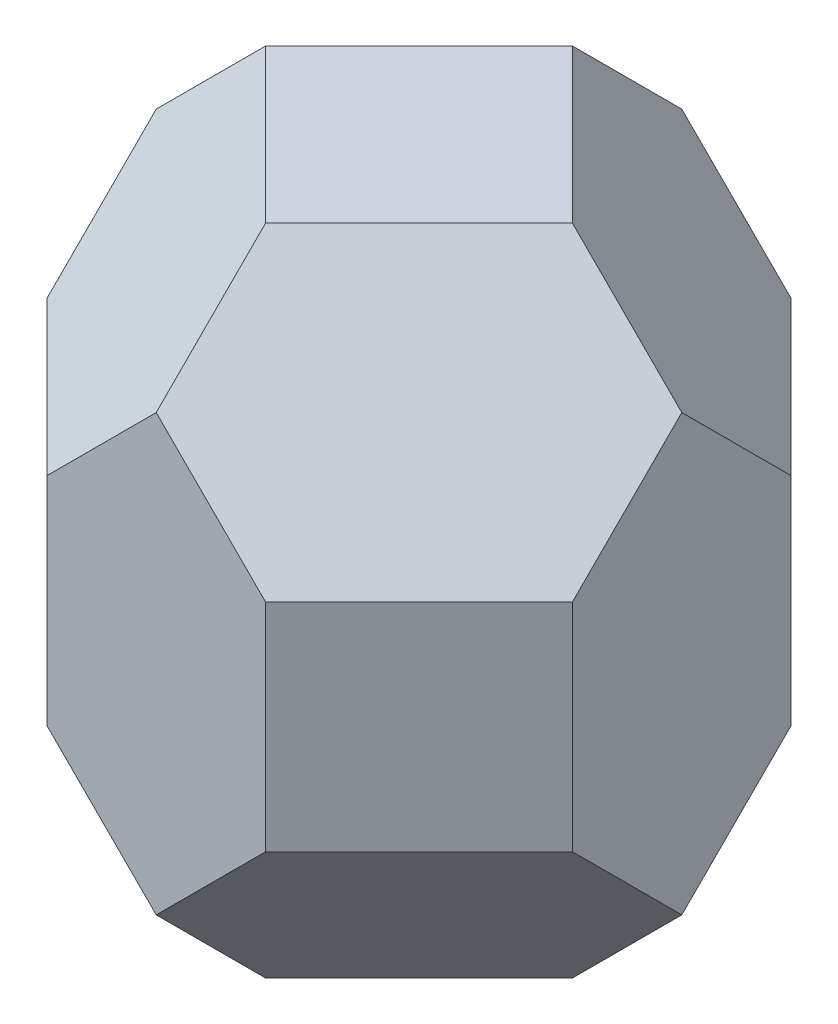
ISO-10303-21;
HEADER;
FILE_DESCRIPTION(('STEP AP214'),'2;1');
FILE_NAME('part.step','',(''),(''),'','','');
FILE_SCHEMA(('AUTOMOTIVE_DESIGN { 1 0 10303 214 1 1 1 1 }'));
ENDSEC;
DATA;
#1=APPLICATION_CONTEXT('core data for automotive mechanical design processes');
#2=APPLICATION_PROTOCOL_DEFINITION('international standard','automotive_design',2000,#1);
#3=PRODUCT_CONTEXT('',#1,'mechanical');
#4=PRODUCT('Part','Part','',(#3));
#5=PRODUCT_RELATED_PRODUCT_CATEGORY('part','',(#4));
#6=PRODUCT_DEFINITION_FORMATION('','',#4);
#7=PRODUCT_DEFINITION_CONTEXT('part definition',#1,'design');
#8=PRODUCT_DEFINITION('design','',#6,#7);
#9=PRODUCT_DEFINITION_SHAPE('','',#8);
#10=(LENGTH_UNIT() NAMED_UNIT(*) SI_UNIT(.MILLI.,.METRE.));
#11=(NAMED_UNIT(*) PLANE_ANGLE_UNIT() SI_UNIT($,.RADIAN.));
#12=(NAMED_UNIT(*) SI_UNIT($,.STERADIAN.) SOLID_ANGLE_UNIT());
#13=UNCERTAINTY_MEASURE_WITH_UNIT(LENGTH_MEASURE(1.E-05),#10,'distance_accuracy_value','');
#14=(GEOMETRIC_REPRESENTATION_CONTEXT(3) GLOBAL_UNCERTAINTY_ASSIGNED_CONTEXT((#13)) GLOBAL_UNIT_ASSIGNED_CONTEXT((#10,
#11,#12)) REPRESENTATION_CONTEXT('',''));
#15=CARTESIAN_POINT('',(0.,0.,0.));
#16=DIRECTION('',(0.,0.,1.));
#17=DIRECTION('',(1.,0.,0.));
#18=AXIS2_PLACEMENT_3D('',#15,#16,#17);
#19=CARTESIAN_POINT('',(0.,0.,0.));
#20=DIRECTION('',(0.,0.,1.));
#21=DIRECTION('',(1.,0.,0.));
#22=AXIS2_PLACEMENT_3D('',#19,#20,#21);
#23=PLANE('',#22);
#24=DIRECTION('',(0.707106781186549,0.707106781186546,0.));
#25=VECTOR('',#24,1.);
#26=CARTESIAN_POINT('',(0.,0.,0.));
#27=LINE('',#26,#25);
#28=CARTESIAN_POINT('',(0.,0.,0.));
#29=VERTEX_POINT('',#28);
#30=CARTESIAN_POINT('',(35.3553390593275,35.3553390593273,0.));
#31=VERTEX_POINT('',#30);
#32=EDGE_CURVE('E259',#29,#31,#27,.T.);
#33=ORIENTED_EDGE('',*,*,#32,.F.);
#34=DIRECTION('',(0.70710678118655,-0.707106781186545,0.));
#35=VECTOR('',#34,1.);
#36=CARTESIAN_POINT('',(0.,0.,0.));
#37=LINE('',#36,#35);
#38=CARTESIAN_POINT('',(-35.3553390593275,35.3553390593273,0.));
#39=VERTEX_POINT('',#38);
#40=EDGE_CURVE('E39',#39,#29,#37,.T.);
#41=ORIENTED_EDGE('',*,*,#40,.F.);
#42=DIRECTION('',(0.,-1.,0.));
#43=VECTOR('',#42,1.);
#44=CARTESIAN_POINT('',(-35.3553390593275,35.3553390593273,0.));
#45=LINE('',#44,#43);
#46=CARTESIAN_POINT('',(-35.3553390593275,105.355339059327,0.));
#47=VERTEX_POINT('',#46);
#48=EDGE_CURVE('E166',#47,#39,#45,.T.);
#49=ORIENTED_EDGE('',*,*,#48,.F.);
#50=DIRECTION('',(-0.707106781186548,-0.707106781186547,0.));
#51=VECTOR('',#50,1.);
#52=CARTESIAN_POINT('',(-35.3553390593275,105.355339059327,0.));
#53=LINE('',#52,#51);
#54=CARTESIAN_POINT('',(-1.06234396279881E-08,140.710678124365,1.63339550218744E-08));
#55=VERTEX_POINT('',#54);
#56=EDGE_CURVE('E159',#55,#47,#53,.T.);
#57=ORIENTED_EDGE('',*,*,#56,.F.);
#58=DIRECTION('',(-0.707106781186549,0.707106781186546,0.));
#59=VECTOR('',#58,1.);
#60=CARTESIAN_POINT('',(35.3553390593274,105.355339059327,0.));
#61=LINE('',#60,#59);
#62=CARTESIAN_POINT('',(35.3553390593274,105.355339059327,0.));
#63=VERTEX_POINT('',#62);
#64=EDGE_CURVE('E147',#63,#55,#61,.T.);
#65=ORIENTED_EDGE('',*,*,#64,.F.);
#66=DIRECTION('',(0.,1.,0.));
#67=VECTOR('',#66,1.);
#68=CARTESIAN_POINT('',(35.3553390593275,35.3553390593273,0.));
#69=LINE('',#68,#67);
#70=EDGE_CURVE('E160',#31,#63,#69,.T.);
#71=ORIENTED_EDGE('',*,*,#70,.F.);
#72=EDGE_LOOP('',(#33,#41,#49,#57,#65,#71));
#73=FACE_BOUND('',#72,.T.);
#74=ADVANCED_FACE('F36',(#73),#23,.F.);
#75=CARTESIAN_POINT('',(17.6776695329851,0.,-17.6776695296637));
#76=DIRECTION('',(0.707106781252975,0.,-0.70710678112012));
#77=DIRECTION('',(-0.70710678112012,0.,-0.707106781252975));
#78=AXIS2_PLACEMENT_3D('',#75,#76,#77);
#79=PLANE('',#78);
#80=DIRECTION('',(0.70710678112012,0.,0.707106781252975));
#81=VECTOR('',#80,1.);
#82=CARTESIAN_POINT('',(85.,105.355339059327,49.6446609500001));
#83=LINE('',#82,#81);
#84=CARTESIAN_POINT('',(84.9999999999999,105.355339059327,49.6446609500001));
#85=VERTEX_POINT('',#84);
#86=EDGE_CURVE('E156',#63,#85,#83,.T.);
#87=ORIENTED_EDGE('',*,*,#86,.T.);
#88=DIRECTION('',(0.,-1.,0.));
#89=VECTOR('',#88,1.);
#90=CARTESIAN_POINT('',(85.,105.355339059327,49.6446609500001));
#91=LINE('',#90,#89);
#92=CARTESIAN_POINT('',(85.,35.3553390593274,49.6446609500001));
#93=VERTEX_POINT('',#92);
#94=EDGE_CURVE('E261',#85,#93,#91,.T.);
#95=ORIENTED_EDGE('',*,*,#94,.T.);
#96=DIRECTION('',(-0.70710678112012,0.,-0.707106781252975));
#97=VECTOR('',#96,1.);
#98=CARTESIAN_POINT('',(35.3553390593275,35.3553390593273,0.));
#99=LINE('',#98,#97);
#100=EDGE_CURVE('E254',#93,#31,#99,.T.);
#101=ORIENTED_EDGE('',*,*,#100,.T.);
#102=ORIENTED_EDGE('',*,*,#70,.T.);
#103=EDGE_LOOP('',(#87,#95,#101,#102));
#104=FACE_BOUND('',#103,.T.);
#105=ADVANCED_FACE('F325',(#104),#79,.T.);
#106=CARTESIAN_POINT('',(-85.,0.,0.));
#107=DIRECTION('',(1.,0.,0.));
#108=DIRECTION('',(0.,1.,0.));
#109=AXIS2_PLACEMENT_3D('',#106,#107,#108);
#110=PLANE('',#109);
#111=DIRECTION('',(0.,-1.,0.));
#112=VECTOR('',#111,1.);
#113=CARTESIAN_POINT('',(-85.,0.,49.64466095));
#114=LINE('',#113,#112);
#115=CARTESIAN_POINT('',(-85.0000000000001,105.355339059327,49.6446609500001));
#116=VERTEX_POINT('',#115);
#117=CARTESIAN_POINT('',(-85.,35.3553390593272,49.64466095));
#118=VERTEX_POINT('',#117);
#119=EDGE_CURVE('E220',#116,#118,#114,.T.);
#120=ORIENTED_EDGE('',*,*,#119,.T.);
#121=DIRECTION('',(0.,-0.707106781186548,0.707106781186547));
#122=VECTOR('',#121,1.);
#123=CARTESIAN_POINT('',(-85.,42.5000000046636,42.5000000046637));
#124=LINE('',#123,#122);
#125=CARTESIAN_POINT('',(-85.0000000031092,6.21797752176079E-09,84.9999999968908));
#126=VERTEX_POINT('',#125);
#127=EDGE_CURVE('E227',#118,#126,#124,.T.);
#128=ORIENTED_EDGE('',*,*,#127,.T.);
#129=DIRECTION('',(0.,-0.707106781186548,-0.707106781186548));
#130=VECTOR('',#129,1.);
#131=CARTESIAN_POINT('',(-85.,-42.4999999953365,42.4999999953364));
#132=LINE('',#131,#130);
#133=CARTESIAN_POINT('',(-85.0000000066428,35.3553390593272,120.355339043357));
#134=VERTEX_POINT('',#133);
#135=EDGE_CURVE('E247',#134,#126,#132,.T.);
#136=ORIENTED_EDGE('',*,*,#135,.F.);
#137=DIRECTION('',(0.,1.,0.));
#138=VECTOR('',#137,1.);
#139=CARTESIAN_POINT('',(-85.0000000066429,35.3553390593272,120.355339043357));
#140=LINE('',#139,#138);
#141=CARTESIAN_POINT('',(-85.0000000000001,105.355339059327,120.35533905));
#142=VERTEX_POINT('',#141);
#143=EDGE_CURVE('E256',#134,#142,#140,.T.);
#144=ORIENTED_EDGE('',*,*,#143,.T.);
#145=DIRECTION('',(0.,0.707106781186548,-0.707106781186547));
#146=VECTOR('',#145,1.);
#147=CARTESIAN_POINT('',(-85.0000000000001,112.855339054664,112.855339054664));
#148=LINE('',#147,#146);
#149=CARTESIAN_POINT('',(-85.0000000000002,140.710678109327,85.));
#150=VERTEX_POINT('',#149);
#151=EDGE_CURVE('E244',#142,#150,#148,.T.);
#152=ORIENTED_EDGE('',*,*,#151,.T.);
#153=DIRECTION('',(0.,0.707106781186548,0.707106781186547));
#154=VECTOR('',#153,1.);
#155=CARTESIAN_POINT('',(-85.,27.8553390546635,-27.8553390546636));
#156=LINE('',#155,#154);
#157=EDGE_CURVE('E241',#116,#150,#156,.T.);
#158=ORIENTED_EDGE('',*,*,#157,.F.);
#159=EDGE_LOOP('',(#120,#128,#136,#144,#152,#158));
#160=FACE_BOUND('',#159,.T.);
#161=ADVANCED_FACE('F297',(#160),#110,.F.);
#162=CARTESIAN_POINT('',(0.,0.,170.));
#163=DIRECTION('',(0.,0.,1.));
#164=DIRECTION('',(1.,0.,0.));
#165=AXIS2_PLACEMENT_3D('',#162,#163,#164);
#166=PLANE('',#165);
#167=DIRECTION('',(0.707106781186549,0.707106781186546,0.));
#168=VECTOR('',#167,1.);
#169=CARTESIAN_POINT('',(0.,0.,170.));
#170=LINE('',#169,#168);
#171=CARTESIAN_POINT('',(4.56445124752403E-09,4.56443736973622E-09,169.999999995436));
#172=VERTEX_POINT('',#171);
#173=CARTESIAN_POINT('',(35.3553390709749,35.3553390543224,169.999999998362));
#174=VERTEX_POINT('',#173);
#175=EDGE_CURVE('E266',#172,#174,#170,.T.);
#176=ORIENTED_EDGE('',*,*,#175,.T.);
#177=DIRECTION('',(0.,1.,0.));
#178=VECTOR('',#177,1.);
#179=CARTESIAN_POINT('',(35.3553390593275,35.3553390593273,170.));
#180=LINE('',#179,#178);
#181=CARTESIAN_POINT('',(35.3553390659701,105.355339059327,169.999999993357));
#182=VERTEX_POINT('',#181);
#183=EDGE_CURVE('E269',#174,#182,#180,.T.);
#184=ORIENTED_EDGE('',*,*,#183,.T.);
#185=DIRECTION('',(-0.707106781186549,0.707106781186546,0.));
#186=VECTOR('',#185,1.);
#187=CARTESIAN_POINT('',(35.3553390593274,105.355339059327,170.));
#188=LINE('',#187,#186);
#189=CARTESIAN_POINT('',(0.,140.710678118655,170.));
#190=VERTEX_POINT('',#189);
#191=EDGE_CURVE('E272',#182,#190,#188,.T.);
#192=ORIENTED_EDGE('',*,*,#191,.T.);
#193=DIRECTION('',(-0.707106781186548,-0.707106781186547,0.));
#194=VECTOR('',#193,1.);
#195=CARTESIAN_POINT('',(-35.3553390593275,105.355339059327,170.));
#196=LINE('',#195,#194);
#197=CARTESIAN_POINT('',(-35.355339062861,105.355339056218,169.999999990248));
#198=VERTEX_POINT('',#197);
#199=EDGE_CURVE('E52',#190,#198,#196,.T.);
#200=ORIENTED_EDGE('',*,*,#199,.T.);
#201=DIRECTION('',(0.,-1.,0.));
#202=VECTOR('',#201,1.);
#203=CARTESIAN_POINT('',(-35.3553390593275,35.3553390593273,170.));
#204=LINE('',#203,#202);
#205=CARTESIAN_POINT('',(-35.355339054763,35.3553390638917,169.999999995436));
#206=VERTEX_POINT('',#205);
#207=EDGE_CURVE('E45',#198,#206,#204,.T.);
#208=ORIENTED_EDGE('',*,*,#207,.T.);
#209=DIRECTION('',(0.70710678118655,-0.707106781186545,0.));
#210=VECTOR('',#209,1.);
#211=CARTESIAN_POINT('',(0.,0.,170.));
#212=LINE('',#211,#210);
#213=EDGE_CURVE('E11',#206,#172,#212,.T.);
#214=ORIENTED_EDGE('',*,*,#213,.T.);
#215=EDGE_LOOP('',(#176,#184,#192,#200,#208,#214));
#216=FACE_BOUND('',#215,.T.);
#217=ADVANCED_FACE('F308',(#216),#166,.T.);
#218=CARTESIAN_POINT('',(-102.677669532985,0.,102.677669513694));
#219=DIRECTION('',(0.707106781252975,0.,-0.70710678112012));
#220=DIRECTION('',(-0.70710678112012,0.,-0.707106781252975));
#221=AXIS2_PLACEMENT_3D('',#218,#219,#220);
#222=PLANE('',#221);
#223=DIRECTION('',(0.70710678112012,0.,0.707106781252975));
#224=VECTOR('',#223,1.);
#225=CARTESIAN_POINT('',(-35.3553390659704,105.355339059327,169.999999993357));
#226=LINE('',#225,#224);
#227=EDGE_CURVE('E251',#142,#198,#226,.T.);
#228=ORIENTED_EDGE('',*,*,#227,.F.);
#229=ORIENTED_EDGE('',*,*,#143,.F.);
#230=DIRECTION('',(-0.70710678112012,0.,-0.707106781252975));
#231=VECTOR('',#230,1.);
#232=CARTESIAN_POINT('',(-85.0000000066429,35.3553390593272,120.355339043357));
#233=LINE('',#232,#231);
#234=EDGE_CURVE('E253',#206,#134,#233,.T.);
#235=ORIENTED_EDGE('',*,*,#234,.F.);
#236=ORIENTED_EDGE('',*,*,#207,.F.);
#237=EDGE_LOOP('',(#228,#229,#235,#236));
#238=FACE_BOUND('',#237,.T.);
#239=ADVANCED_FACE('F305',(#238),#222,.F.);
#240=CARTESIAN_POINT('',(85.,0.,0.));
#241=DIRECTION('',(1.,0.,0.));
#242=DIRECTION('',(0.,1.,0.));
#243=AXIS2_PLACEMENT_3D('',#240,#241,#242);
#244=PLANE('',#243);
#245=ORIENTED_EDGE('',*,*,#94,.F.);
#246=DIRECTION('',(0.,0.707106781186548,0.707106781186547));
#247=VECTOR('',#246,1.);
#248=CARTESIAN_POINT('',(85.,27.8553390546637,-27.8553390546636));
#249=LINE('',#248,#247);
#250=CARTESIAN_POINT('',(84.9999999999999,140.710678109327,85.0000000000001));
#251=VERTEX_POINT('',#250);
#252=EDGE_CURVE('E224',#85,#251,#249,.T.);
#253=ORIENTED_EDGE('',*,*,#252,.T.);
#254=DIRECTION('',(0.,0.707106781186548,-0.707106781186547));
#255=VECTOR('',#254,1.);
#256=CARTESIAN_POINT('',(84.9999999999999,112.855339054664,112.855339054664));
#257=LINE('',#256,#255);
#258=CARTESIAN_POINT('',(85.0000000097519,105.355339062437,120.355339046467));
#259=VERTEX_POINT('',#258);
#260=EDGE_CURVE('E226',#259,#251,#257,.T.);
#261=ORIENTED_EDGE('',*,*,#260,.F.);
#262=DIRECTION('',(0.,-1.,0.));
#263=VECTOR('',#262,1.);
#264=CARTESIAN_POINT('',(85.,0.,120.35533905));
#265=LINE('',#264,#263);
#266=CARTESIAN_POINT('',(85.,35.3553390593273,120.35533905));
#267=VERTEX_POINT('',#266);
#268=EDGE_CURVE('E230',#259,#267,#265,.T.);
#269=ORIENTED_EDGE('',*,*,#268,.T.);
#270=DIRECTION('',(0.,-0.707106781186548,-0.707106781186548));
#271=VECTOR('',#270,1.);
#272=CARTESIAN_POINT('',(85.,-42.4999999953363,42.4999999953364));
#273=LINE('',#272,#271);
#274=CARTESIAN_POINT('',(85.,9.32733751346504E-09,85.));
#275=VERTEX_POINT('',#274);
#276=EDGE_CURVE('E233',#267,#275,#273,.T.);
#277=ORIENTED_EDGE('',*,*,#276,.T.);
#278=DIRECTION('',(0.,-0.707106781186548,0.707106781186547));
#279=VECTOR('',#278,1.);
#280=CARTESIAN_POINT('',(85.,42.5000000046637,42.5000000046637));
#281=LINE('',#280,#279);
#282=EDGE_CURVE('E236',#93,#275,#281,.T.);
#283=ORIENTED_EDGE('',*,*,#282,.F.);
#284=EDGE_LOOP('',(#245,#253,#261,#269,#277,#283));
#285=FACE_BOUND('',#284,.T.);
#286=ADVANCED_FACE('F318',(#285),#244,.T.);
#287=CARTESIAN_POINT('',(102.677669532985,0.,102.677669513694));
#288=DIRECTION('',(0.707106781252975,0.,0.70710678112012));
#289=DIRECTION('',(0.70710678112012,0.,-0.707106781252975));
#290=AXIS2_PLACEMENT_3D('',#287,#288,#289);
#291=PLANE('',#290);
#292=DIRECTION('',(0.70710678112012,0.,-0.707106781252975));
#293=VECTOR('',#292,1.);
#294=CARTESIAN_POINT('',(85.0000000066427,105.355339059327,120.355339043357));
#295=LINE('',#294,#293);
#296=EDGE_CURVE('E214',#182,#259,#295,.T.);
#297=ORIENTED_EDGE('',*,*,#296,.F.);
#298=ORIENTED_EDGE('',*,*,#183,.F.);
#299=DIRECTION('',(-0.70710678112012,0.,0.707106781252975));
#300=VECTOR('',#299,1.);
#301=CARTESIAN_POINT('',(35.3553390659701,35.3553390593272,169.999999993357));
#302=LINE('',#301,#300);
#303=EDGE_CURVE('E217',#267,#174,#302,.T.);
#304=ORIENTED_EDGE('',*,*,#303,.F.);
#305=ORIENTED_EDGE('',*,*,#268,.F.);
#306=EDGE_LOOP('',(#297,#298,#304,#305));
#307=FACE_BOUND('',#306,.T.);
#308=ADVANCED_FACE('F321',(#307),#291,.T.);
#309=CARTESIAN_POINT('',(-17.6776695329851,0.,-17.6776695296637));
#310=DIRECTION('',(0.707106781252975,0.,0.70710678112012));
#311=DIRECTION('',(0.70710678112012,0.,-0.707106781252975));
#312=AXIS2_PLACEMENT_3D('',#309,#310,#311);
#313=PLANE('',#312);
#314=DIRECTION('',(0.70710678112012,0.,-0.707106781252975));
#315=VECTOR('',#314,1.);
#316=CARTESIAN_POINT('',(-35.3553390593275,105.355339059327,0.));
#317=LINE('',#316,#315);
#318=EDGE_CURVE('E213',#116,#47,#317,.T.);
#319=ORIENTED_EDGE('',*,*,#318,.T.);
#320=ORIENTED_EDGE('',*,*,#48,.T.);
#321=DIRECTION('',(-0.70710678112012,0.,0.707106781252975));
#322=VECTOR('',#321,1.);
#323=CARTESIAN_POINT('',(-85.,35.3553390593272,49.64466095));
#324=LINE('',#323,#322);
#325=EDGE_CURVE('E218',#39,#118,#324,.T.);
#326=ORIENTED_EDGE('',*,*,#325,.T.);
#327=ORIENTED_EDGE('',*,*,#119,.F.);
#328=EDGE_LOOP('',(#319,#320,#326,#327));
#329=FACE_BOUND('',#328,.T.);
#330=ADVANCED_FACE('F299',(#329),#313,.F.);
#331=CARTESIAN_POINT('',(0.,0.,0.));
#332=DIRECTION('',(0.577350269189624,0.577350269189627,0.577350269189627));
#333=DIRECTION('',(0.,-0.707106781186547,0.707106781186548));
#334=AXIS2_PLACEMENT_3D('',#331,#332,#333);
#335=PLANE('',#334);
#336=ORIENTED_EDGE('',*,*,#325,.F.);
#337=ORIENTED_EDGE('',*,*,#40,.T.);
#338=DIRECTION('',(1.42262395179449E-10,0.707106781115416,-0.707106781257679));
#339=VECTOR('',#338,1.);
#340=CARTESIAN_POINT('',(-7.11311975548938E-09,-35.3553390384584,35.3553390455715));
#341=LINE('',#340,#339);
#342=CARTESIAN_POINT('',(-7.11311975548938E-09,-35.3553390384584,35.3553390455715));
#343=VERTEX_POINT('',#342);
#344=EDGE_CURVE('E210',#343,#29,#341,.T.);
#345=ORIENTED_EDGE('',*,*,#344,.F.);
#346=DIRECTION('',(0.707106781164406,4.42869432705693E-11,-0.707106781208689));
#347=VECTOR('',#346,1.);
#348=CARTESIAN_POINT('',(-7.11311975548938E-09,-35.3553390384584,35.3553390455715));
#349=LINE('',#348,#347);
#350=CARTESIAN_POINT('',(-49.6446609508949,-35.3553390415677,84.9999999924624));
#351=VERTEX_POINT('',#350);
#352=EDGE_CURVE('E208',#351,#343,#349,.T.);
#353=ORIENTED_EDGE('',*,*,#352,.F.);
#354=DIRECTION('',(0.707106781230834,-0.707106781142261,-8.85688744801063E-11));
#355=VECTOR('',#354,1.);
#356=CARTESIAN_POINT('',(-49.6446609508949,-35.3553390415677,84.9999999924624));
#357=LINE('',#356,#355);
#358=EDGE_CURVE('E206',#126,#351,#357,.T.);
#359=ORIENTED_EDGE('',*,*,#358,.F.);
#360=ORIENTED_EDGE('',*,*,#127,.F.);
#361=EDGE_LOOP('',(#336,#337,#345,#353,#359,#360));
#362=FACE_BOUND('',#361,.T.);
#363=ADVANCED_FACE('F283',(#362),#335,.F.);
#364=CARTESIAN_POINT('',(0.,0.,0.));
#365=DIRECTION('',(0.577350269189624,-0.577350269189626,-0.577350269189627));
#366=DIRECTION('',(0.,0.707106781186548,-0.707106781186547));
#367=AXIS2_PLACEMENT_3D('',#364,#365,#366);
#368=PLANE('',#367);
#369=ORIENTED_EDGE('',*,*,#282,.T.);
#370=DIRECTION('',(0.707106781115417,0.707106781257678,-1.42263721440519E-10));
#371=VECTOR('',#370,1.);
#372=CARTESIAN_POINT('',(42.5000000155467,-42.499999989895,85.0000000054414));
#373=LINE('',#372,#371);
#374=CARTESIAN_POINT('',(49.6446609393535,-35.3553390646509,85.0000000040039));
#375=VERTEX_POINT('',#374);
#376=EDGE_CURVE('E201',#375,#275,#373,.T.);
#377=ORIENTED_EDGE('',*,*,#376,.F.);
#378=DIRECTION('',(-0.707106781164407,4.42859274418484E-11,-0.707106781208689));
#379=VECTOR('',#378,1.);
#380=CARTESIAN_POINT('',(-17.6776695318779,-35.3553390604345,17.6776695285566));
#381=LINE('',#380,#379);
#382=EDGE_CURVE('E203',#375,#343,#381,.T.);
#383=ORIENTED_EDGE('',*,*,#382,.T.);
#384=ORIENTED_EDGE('',*,*,#344,.T.);
#385=ORIENTED_EDGE('',*,*,#32,.T.);
#386=ORIENTED_EDGE('',*,*,#100,.F.);
#387=EDGE_LOOP('',(#369,#377,#383,#384,#385,#386));
#388=FACE_BOUND('',#387,.T.);
#389=ADVANCED_FACE('F286',(#388),#368,.T.);
#390=CARTESIAN_POINT('',(-8.21952928638035E-09,-35.3553390280245,-1.04338764480366E-08));
#391=DIRECTION('',(-2.32483396068275E-10,-1.,-2.95114591880059E-10));
#392=DIRECTION('',(0.,2.95114591880059E-10,-1.));
#393=AXIS2_PLACEMENT_3D('',#390,#391,#392);
#394=PLANE('',#393);
#395=DIRECTION('',(-0.707106781164406,-4.42869432840173E-11,0.707106781208689));
#396=VECTOR('',#395,1.);
#397=CARTESIAN_POINT('',(49.6446609393534,-35.3553390646508,85.0000000040039));
#398=LINE('',#397,#396);
#399=CARTESIAN_POINT('',(1.4337947495946E-08,-35.3553390683335,134.644660949679));
#400=VERTEX_POINT('',#399);
#401=EDGE_CURVE('E195',#375,#400,#398,.T.);
#402=ORIENTED_EDGE('',*,*,#401,.T.);
#403=DIRECTION('',(-0.707106781316048,3.73068115010534E-10,-0.707106781057047));
#404=VECTOR('',#403,1.);
#405=CARTESIAN_POINT('',(1.06465530211201E-08,-35.3553390677601,134.64466093582));
#406=LINE('',#405,#404);
#407=EDGE_CURVE('E198',#400,#351,#406,.T.);
#408=ORIENTED_EDGE('',*,*,#407,.T.);
#409=ORIENTED_EDGE('',*,*,#352,.T.);
#410=ORIENTED_EDGE('',*,*,#382,.F.);
#411=EDGE_LOOP('',(#402,#408,#409,#410));
#412=FACE_BOUND('',#411,.T.);
#413=ADVANCED_FACE('F291',(#412),#394,.T.);
#414=CARTESIAN_POINT('',(-56.6666666637632,-56.6666666637636,56.6666666687468));
#415=DIRECTION('',(-0.5773502691727,-0.577350269172703,0.577350269223475));
#416=DIRECTION('',(0.,-0.707106781217639,-0.707106781155456));
#417=AXIS2_PLACEMENT_3D('',#414,#415,#416);
#418=PLANE('',#417);
#419=ORIENTED_EDGE('',*,*,#135,.T.);
#420=ORIENTED_EDGE('',*,*,#358,.T.);
#421=ORIENTED_EDGE('',*,*,#407,.F.);
#422=DIRECTION('',(8.96987659979909E-11,0.707106781172789,0.707106781200306));
#423=VECTOR('',#422,1.);
#424=CARTESIAN_POINT('',(-6.21807466627544E-09,-84.9999999954356,84.9999999921279));
#425=LINE('',#424,#423);
#426=EDGE_CURVE('E192',#400,#172,#425,.T.);
#427=ORIENTED_EDGE('',*,*,#426,.T.);
#428=ORIENTED_EDGE('',*,*,#213,.F.);
#429=ORIENTED_EDGE('',*,*,#234,.T.);
#430=EDGE_LOOP('',(#419,#420,#421,#427,#428,#429));
#431=FACE_BOUND('',#430,.T.);
#432=ADVANCED_FACE('F355',(#431),#418,.T.);
#433=CARTESIAN_POINT('',(56.6666666867117,-56.6666666589268,56.6666666589268));
#434=DIRECTION('',(0.577350269378351,-0.577350269095263,0.577350269095263));
#435=DIRECTION('',(0.707106781013193,0.,-0.707106781359902));
#436=AXIS2_PLACEMENT_3D('',#433,#434,#435);
#437=PLANE('',#436);
#438=ORIENTED_EDGE('',*,*,#276,.F.);
#439=ORIENTED_EDGE('',*,*,#303,.T.);
#440=ORIENTED_EDGE('',*,*,#175,.F.);
#441=ORIENTED_EDGE('',*,*,#426,.F.);
#442=ORIENTED_EDGE('',*,*,#401,.F.);
#443=ORIENTED_EDGE('',*,*,#376,.T.);
#444=EDGE_LOOP('',(#438,#439,#440,#441,#442,#443));
#445=FACE_BOUND('',#444,.T.);
#446=ADVANCED_FACE('F323',(#445),#437,.T.);
#447=CARTESIAN_POINT('',(103.570226039551,103.570226039552,103.570226039552));
#448=DIRECTION('',(-0.577350269189624,-0.577350269189626,-0.577350269189627));
#449=DIRECTION('',(0.,0.707106781186548,-0.707106781186547));
#450=AXIS2_PLACEMENT_3D('',#447,#448,#449);
#451=PLANE('',#450);
#452=ORIENTED_EDGE('',*,*,#191,.F.);
#453=ORIENTED_EDGE('',*,*,#296,.T.);
#454=ORIENTED_EDGE('',*,*,#260,.T.);
#455=DIRECTION('',(0.707106781068392,-0.707106781304703,2.36313413800755E-10));
#456=VECTOR('',#455,1.);
#457=CARTESIAN_POINT('',(112.855339057773,112.855339048464,85.0000000124185));
#458=LINE('',#457,#456);
#459=CARTESIAN_POINT('',(49.6446609534247,176.06601715611,85.0000000002072));
#460=VERTEX_POINT('',#459);
#461=EDGE_CURVE('E189',#460,#251,#458,.T.);
#462=ORIENTED_EDGE('',*,*,#461,.F.);
#463=DIRECTION('',(0.70710678126042,-1.47740458755763E-10,-0.707106781112675));
#464=VECTOR('',#463,1.);
#465=CARTESIAN_POINT('',(67.3223304900228,176.06601716133,67.3223304673026));
#466=LINE('',#465,#464);
#467=CARTESIAN_POINT('',(-8.70613303671774E-09,176.066017172286,134.644660928334));
#468=VERTEX_POINT('',#467);
#469=EDGE_CURVE('E187',#468,#460,#466,.T.);
#470=ORIENTED_EDGE('',*,*,#469,.F.);
#471=DIRECTION('',(-2.36309735065849E-10,-0.707106781068393,0.707106781304702));
#472=VECTOR('',#471,1.);
#473=CARTESIAN_POINT('',(4.89411289272823E-09,155.355339082839,155.355339030921));
#474=LINE('',#473,#472);
#475=EDGE_CURVE('E184',#468,#190,#474,.T.);
#476=ORIENTED_EDGE('',*,*,#475,.T.);
#477=EDGE_LOOP('',(#452,#453,#454,#462,#470,#476));
#478=FACE_BOUND('',#477,.T.);
#479=ADVANCED_FACE('F312',(#478),#451,.F.);
#480=CARTESIAN_POINT('',(-103.570226036442,103.570226036443,103.570226036443));
#481=DIRECTION('',(-0.577350269189622,0.577350269189627,0.577350269189629));
#482=DIRECTION('',(0.,-0.707106781186549,0.707106781186546));
#483=AXIS2_PLACEMENT_3D('',#480,#481,#482);
#484=PLANE('',#483);
#485=ORIENTED_EDGE('',*,*,#199,.F.);
#486=ORIENTED_EDGE('',*,*,#475,.F.);
#487=DIRECTION('',(0.707106781260422,1.47739895056646E-10,0.707106781112673));
#488=VECTOR('',#487,1.);
#489=CARTESIAN_POINT('',(-67.3223304869134,176.06601715822,67.3223304641938));
#490=LINE('',#489,#488);
#491=CARTESIAN_POINT('',(-49.6446609525866,176.066017161914,84.9999999948269));
#492=VERTEX_POINT('',#491);
#493=EDGE_CURVE('E179',#492,#468,#490,.T.);
#494=ORIENTED_EDGE('',*,*,#493,.F.);
#495=DIRECTION('',(-0.707106781134819,-0.707106781238276,1.03463233690579E-10));
#496=VECTOR('',#495,1.);
#497=CARTESIAN_POINT('',(-112.855339054663,112.855339050589,85.0000000040758));
#498=LINE('',#497,#496);
#499=EDGE_CURVE('E182',#492,#150,#498,.T.);
#500=ORIENTED_EDGE('',*,*,#499,.T.);
#501=ORIENTED_EDGE('',*,*,#151,.F.);
#502=ORIENTED_EDGE('',*,*,#227,.T.);
#503=EDGE_LOOP('',(#485,#486,#494,#500,#501,#502));
#504=FACE_BOUND('',#503,.T.);
#505=ADVANCED_FACE('F300',(#504),#484,.T.);
#506=CARTESIAN_POINT('',(-5.51363447002968E-09,176.066017148371,-3.12728403114232E-08));
#507=DIRECTION('',(-3.13157221327006E-11,1.,-1.77619967884373E-10));
#508=DIRECTION('',(0.,1.77619967884373E-10,1.));
#509=AXIS2_PLACEMENT_3D('',#506,#507,#508);
#510=PLANE('',#509);
#511=ORIENTED_EDGE('',*,*,#469,.T.);
#512=DIRECTION('',(0.707106781479043,1.4773984320017E-10,0.707106780894053));
#513=VECTOR('',#512,1.);
#514=CARTESIAN_POINT('',(-17.6776695534065,176.066017150957,17.6776695312447));
#515=LINE('',#514,#513);
#516=CARTESIAN_POINT('',(-8.7068442733429E-09,176.066017154651,35.3553390613196));
#517=VERTEX_POINT('',#516);
#518=EDGE_CURVE('E174',#517,#460,#515,.T.);
#519=ORIENTED_EDGE('',*,*,#518,.F.);
#520=DIRECTION('',(0.707106781260422,-1.03452724271956E-10,-0.707106781112673));
#521=VECTOR('',#520,1.);
#522=CARTESIAN_POINT('',(17.6776695391864,176.066017152064,17.6776695171209));
#523=LINE('',#522,#521);
#524=EDGE_CURVE('E173',#492,#517,#523,.T.);
#525=ORIENTED_EDGE('',*,*,#524,.F.);
#526=ORIENTED_EDGE('',*,*,#493,.T.);
#527=EDGE_LOOP('',(#511,#519,#525,#526));
#528=FACE_BOUND('',#527,.T.);
#529=ADVANCED_FACE('F315',(#528),#510,.T.);
#530=CARTESIAN_POINT('',(46.9035593697755,46.9035593697758,-46.9035593697758));
#531=DIRECTION('',(-0.577350269189624,-0.577350269189627,0.577350269189627));
#532=DIRECTION('',(0.,-0.707106781186547,-0.707106781186548));
#533=AXIS2_PLACEMENT_3D('',#530,#531,#532);
#534=PLANE('',#533);
#535=ORIENTED_EDGE('',*,*,#64,.T.);
#536=DIRECTION('',(-5.27336507953159E-11,-0.707106781160181,-0.707106781212914));
#537=VECTOR('',#536,1.);
#538=CARTESIAN_POINT('',(-4.72621941582929E-10,176.066017162885,35.3553390530854));
#539=LINE('',#538,#537);
#540=EDGE_CURVE('E152',#517,#55,#539,.T.);
#541=ORIENTED_EDGE('',*,*,#540,.F.);
#542=ORIENTED_EDGE('',*,*,#518,.T.);
#543=ORIENTED_EDGE('',*,*,#461,.T.);
#544=ORIENTED_EDGE('',*,*,#252,.F.);
#545=ORIENTED_EDGE('',*,*,#86,.F.);
#546=EDGE_LOOP('',(#535,#541,#542,#543,#544,#545));
#547=FACE_BOUND('',#546,.T.);
#548=ADVANCED_FACE('F149',(#547),#534,.F.);
#549=CARTESIAN_POINT('',(-46.9035593921564,46.9035593784311,-46.9035593563865));
#550=DIRECTION('',(0.57735026939271,-0.57735026922376,0.577350268952407));
#551=DIRECTION('',(0.707106781083087,0.707106781290007,0.));
#552=AXIS2_PLACEMENT_3D('',#549,#550,#551);
#553=PLANE('',#552);
#554=ORIENTED_EDGE('',*,*,#499,.F.);
#555=ORIENTED_EDGE('',*,*,#524,.T.);
#556=ORIENTED_EDGE('',*,*,#540,.T.);
#557=ORIENTED_EDGE('',*,*,#56,.T.);
#558=ORIENTED_EDGE('',*,*,#318,.F.);
#559=ORIENTED_EDGE('',*,*,#157,.T.);
#560=EDGE_LOOP('',(#554,#555,#556,#557,#558,#559));
#561=FACE_BOUND('',#560,.T.);
#562=ADVANCED_FACE('F171',(#561),#553,.F.);
#563=CLOSED_SHELL('',(#74,#105,#161,#217,#239,#286,#308,#330,#363,#389,#413,#432,#446,#479,#505,
#529,#548,#562));
#564=MANIFOLD_SOLID_BREP('B2',#563);
#565=ADVANCED_BREP_SHAPE_REPRESENTATION('',(#18,#564),#14);
#566=SHAPE_DEFINITION_REPRESENTATION(#9,#565);
ENDSEC;
END-ISO-10303-21;
